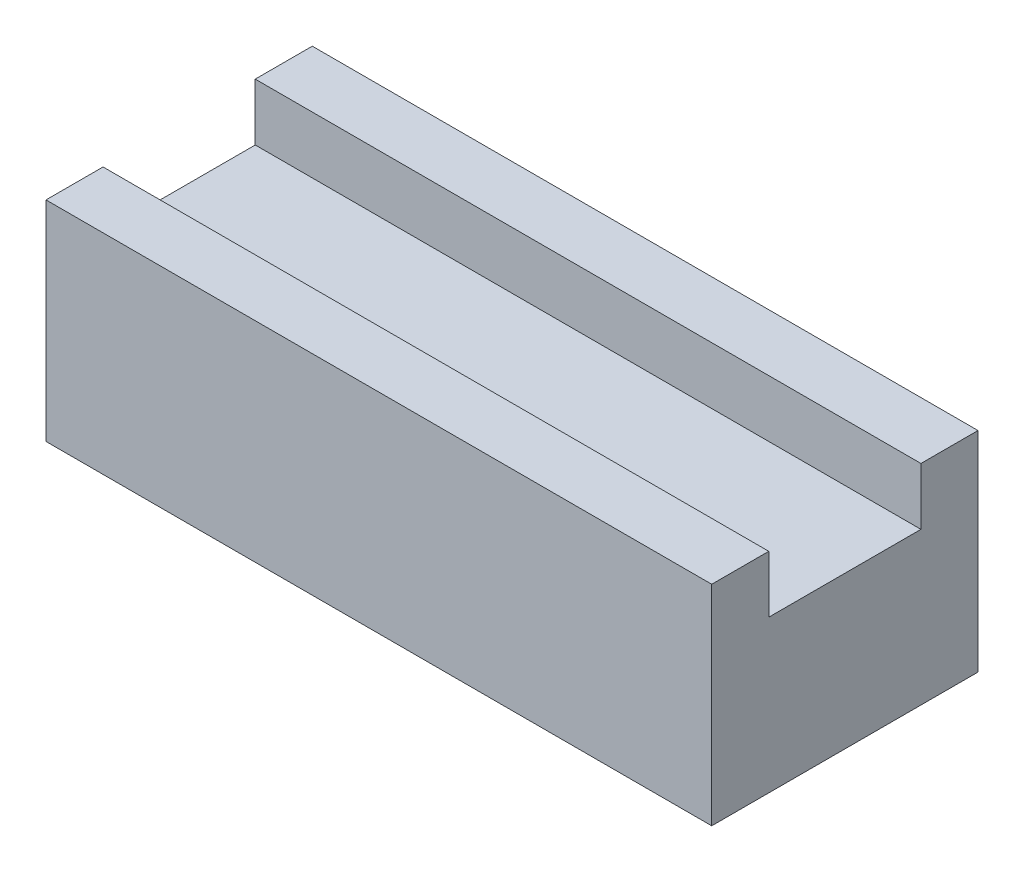
ISO-10303-21;
HEADER;
FILE_DESCRIPTION(('STEP AP214'),'2;1');
FILE_NAME('part.step','',(''),(''),'','','');
FILE_SCHEMA(('AUTOMOTIVE_DESIGN { 1 0 10303 214 1 1 1 1 }'));
ENDSEC;
DATA;
#1=APPLICATION_CONTEXT('core data for automotive mechanical design processes');
#2=APPLICATION_PROTOCOL_DEFINITION('international standard','automotive_design',2000,#1);
#3=PRODUCT_CONTEXT('',#1,'mechanical');
#4=PRODUCT('Part','Part','',(#3));
#5=PRODUCT_RELATED_PRODUCT_CATEGORY('part','',(#4));
#6=PRODUCT_DEFINITION_FORMATION('','',#4);
#7=PRODUCT_DEFINITION_CONTEXT('part definition',#1,'design');
#8=PRODUCT_DEFINITION('design','',#6,#7);
#9=PRODUCT_DEFINITION_SHAPE('','',#8);
#10=(LENGTH_UNIT() NAMED_UNIT(*) SI_UNIT(.MILLI.,.METRE.));
#11=(NAMED_UNIT(*) PLANE_ANGLE_UNIT() SI_UNIT($,.RADIAN.));
#12=(NAMED_UNIT(*) SI_UNIT($,.STERADIAN.) SOLID_ANGLE_UNIT());
#13=UNCERTAINTY_MEASURE_WITH_UNIT(LENGTH_MEASURE(1.E-05),#10,'distance_accuracy_value','');
#14=(GEOMETRIC_REPRESENTATION_CONTEXT(3) GLOBAL_UNCERTAINTY_ASSIGNED_CONTEXT((#13)) GLOBAL_UNIT_ASSIGNED_CONTEXT((#10,
#11,#12)) REPRESENTATION_CONTEXT('',''));
#15=CARTESIAN_POINT('',(0.,0.,0.));
#16=DIRECTION('',(0.,0.,1.));
#17=DIRECTION('',(1.,0.,0.));
#18=AXIS2_PLACEMENT_3D('',#15,#16,#17);
#19=CARTESIAN_POINT('',(-35.,-4.,-7.));
#20=DIRECTION('',(0.,0.,-1.));
#21=DIRECTION('',(0.,1.,0.));
#22=AXIS2_PLACEMENT_3D('',#19,#20,#21);
#23=PLANE('',#22);
#24=DIRECTION('',(0.,1.,0.));
#25=VECTOR('',#24,1.);
#26=CARTESIAN_POINT('',(0.,-4.,-7.));
#27=LINE('',#26,#25);
#28=CARTESIAN_POINT('',(0.,-4.,-7.));
#29=VERTEX_POINT('',#28);
#30=CARTESIAN_POINT('',(0.,7.,-7.));
#31=VERTEX_POINT('',#30);
#32=EDGE_CURVE('E153',#29,#31,#27,.T.);
#33=ORIENTED_EDGE('',*,*,#32,.F.);
#34=DIRECTION('',(1.,0.,0.));
#35=VECTOR('',#34,1.);
#36=CARTESIAN_POINT('',(-35.,-4.,-7.));
#37=LINE('',#36,#35);
#38=CARTESIAN_POINT('',(-35.,-4.,-7.));
#39=VERTEX_POINT('',#38);
#40=EDGE_CURVE('E11',#39,#29,#37,.T.);
#41=ORIENTED_EDGE('',*,*,#40,.F.);
#42=DIRECTION('',(0.,1.,0.));
#43=VECTOR('',#42,1.);
#44=CARTESIAN_POINT('',(-35.,4.,-7.));
#45=LINE('',#44,#43);
#46=CARTESIAN_POINT('',(-35.,7.,-7.));
#47=VERTEX_POINT('',#46);
#48=EDGE_CURVE('E56',#39,#47,#45,.T.);
#49=ORIENTED_EDGE('',*,*,#48,.T.);
#50=DIRECTION('',(1.,0.,0.));
#51=VECTOR('',#50,1.);
#52=CARTESIAN_POINT('',(-35.,7.,-7.));
#53=LINE('',#52,#51);
#54=EDGE_CURVE('E41',#47,#31,#53,.T.);
#55=ORIENTED_EDGE('',*,*,#54,.T.);
#56=EDGE_LOOP('',(#33,#41,#49,#55));
#57=FACE_BOUND('',#56,.T.);
#58=ADVANCED_FACE('F37',(#57),#23,.T.);
#59=CARTESIAN_POINT('',(-35.,-4.,7.));
#60=DIRECTION('',(0.,-1.,0.));
#61=DIRECTION('',(0.,0.,-1.));
#62=AXIS2_PLACEMENT_3D('',#59,#60,#61);
#63=PLANE('',#62);
#64=DIRECTION('',(0.,0.,-1.));
#65=VECTOR('',#64,1.);
#66=CARTESIAN_POINT('',(0.,-4.,7.));
#67=LINE('',#66,#65);
#68=CARTESIAN_POINT('',(0.,-4.,7.));
#69=VERTEX_POINT('',#68);
#70=EDGE_CURVE('E151',#69,#29,#67,.T.);
#71=ORIENTED_EDGE('',*,*,#70,.F.);
#72=DIRECTION('',(1.,0.,0.));
#73=VECTOR('',#72,1.);
#74=CARTESIAN_POINT('',(-35.,-4.,7.));
#75=LINE('',#74,#73);
#76=CARTESIAN_POINT('',(-35.,-4.,7.));
#77=VERTEX_POINT('',#76);
#78=EDGE_CURVE('E47',#77,#69,#75,.T.);
#79=ORIENTED_EDGE('',*,*,#78,.F.);
#80=DIRECTION('',(0.,0.,-1.));
#81=VECTOR('',#80,1.);
#82=CARTESIAN_POINT('',(-35.,-4.,7.));
#83=LINE('',#82,#81);
#84=EDGE_CURVE('E126',#77,#39,#83,.T.);
#85=ORIENTED_EDGE('',*,*,#84,.T.);
#86=ORIENTED_EDGE('',*,*,#40,.T.);
#87=EDGE_LOOP('',(#71,#79,#85,#86));
#88=FACE_BOUND('',#87,.T.);
#89=ADVANCED_FACE('F166',(#88),#63,.T.);
#90=CARTESIAN_POINT('',(-35.,-4.,7.));
#91=DIRECTION('',(0.,0.,1.));
#92=DIRECTION('',(0.,-1.,0.));
#93=AXIS2_PLACEMENT_3D('',#90,#91,#92);
#94=PLANE('',#93);
#95=DIRECTION('',(0.,-1.,0.));
#96=VECTOR('',#95,1.);
#97=CARTESIAN_POINT('',(0.,-4.,7.));
#98=LINE('',#97,#96);
#99=CARTESIAN_POINT('',(0.,7.,7.));
#100=VERTEX_POINT('',#99);
#101=EDGE_CURVE('E114',#100,#69,#98,.T.);
#102=ORIENTED_EDGE('',*,*,#101,.F.);
#103=DIRECTION('',(1.,0.,0.));
#104=VECTOR('',#103,1.);
#105=CARTESIAN_POINT('',(-35.,7.,7.));
#106=LINE('',#105,#104);
#107=CARTESIAN_POINT('',(-35.,7.,7.));
#108=VERTEX_POINT('',#107);
#109=EDGE_CURVE('E109',#108,#100,#106,.T.);
#110=ORIENTED_EDGE('',*,*,#109,.F.);
#111=DIRECTION('',(0.,-1.,0.));
#112=VECTOR('',#111,1.);
#113=CARTESIAN_POINT('',(-35.,4.,7.));
#114=LINE('',#113,#112);
#115=EDGE_CURVE('E112',#108,#77,#114,.T.);
#116=ORIENTED_EDGE('',*,*,#115,.T.);
#117=ORIENTED_EDGE('',*,*,#78,.T.);
#118=EDGE_LOOP('',(#102,#110,#116,#117));
#119=FACE_BOUND('',#118,.T.);
#120=ADVANCED_FACE('F111',(#119),#94,.T.);
#121=CARTESIAN_POINT('',(-35.,7.,7.));
#122=DIRECTION('',(0.,1.,0.));
#123=DIRECTION('',(0.,0.,1.));
#124=AXIS2_PLACEMENT_3D('',#121,#122,#123);
#125=PLANE('',#124);
#126=DIRECTION('',(0.,0.,1.));
#127=VECTOR('',#126,1.);
#128=CARTESIAN_POINT('',(0.,7.,7.));
#129=LINE('',#128,#127);
#130=CARTESIAN_POINT('',(0.,7.,4.));
#131=VERTEX_POINT('',#130);
#132=EDGE_CURVE('E148',#131,#100,#129,.T.);
#133=ORIENTED_EDGE('',*,*,#132,.F.);
#134=DIRECTION('',(1.,0.,0.));
#135=VECTOR('',#134,1.);
#136=CARTESIAN_POINT('',(-35.,7.,4.));
#137=LINE('',#136,#135);
#138=CARTESIAN_POINT('',(-35.,7.,4.));
#139=VERTEX_POINT('',#138);
#140=EDGE_CURVE('E119',#139,#131,#137,.T.);
#141=ORIENTED_EDGE('',*,*,#140,.F.);
#142=DIRECTION('',(0.,0.,1.));
#143=VECTOR('',#142,1.);
#144=CARTESIAN_POINT('',(-35.,7.,7.));
#145=LINE('',#144,#143);
#146=EDGE_CURVE('E124',#139,#108,#145,.T.);
#147=ORIENTED_EDGE('',*,*,#146,.T.);
#148=ORIENTED_EDGE('',*,*,#109,.T.);
#149=EDGE_LOOP('',(#133,#141,#147,#148));
#150=FACE_BOUND('',#149,.T.);
#151=ADVANCED_FACE('F128',(#150),#125,.T.);
#152=CARTESIAN_POINT('',(-35.,7.,4.));
#153=DIRECTION('',(0.,0.,-1.));
#154=DIRECTION('',(0.,1.,0.));
#155=AXIS2_PLACEMENT_3D('',#152,#153,#154);
#156=PLANE('',#155);
#157=DIRECTION('',(0.,1.,0.));
#158=VECTOR('',#157,1.);
#159=CARTESIAN_POINT('',(0.,7.,4.));
#160=LINE('',#159,#158);
#161=CARTESIAN_POINT('',(0.,4.,4.));
#162=VERTEX_POINT('',#161);
#163=EDGE_CURVE('E145',#162,#131,#160,.T.);
#164=ORIENTED_EDGE('',*,*,#163,.F.);
#165=DIRECTION('',(1.,0.,0.));
#166=VECTOR('',#165,1.);
#167=CARTESIAN_POINT('',(-35.,4.,4.));
#168=LINE('',#167,#166);
#169=CARTESIAN_POINT('',(-35.,4.,4.));
#170=VERTEX_POINT('',#169);
#171=EDGE_CURVE('E157',#170,#162,#168,.T.);
#172=ORIENTED_EDGE('',*,*,#171,.F.);
#173=DIRECTION('',(0.,1.,0.));
#174=VECTOR('',#173,1.);
#175=CARTESIAN_POINT('',(-35.,7.,4.));
#176=LINE('',#175,#174);
#177=EDGE_CURVE('E129',#170,#139,#176,.T.);
#178=ORIENTED_EDGE('',*,*,#177,.T.);
#179=ORIENTED_EDGE('',*,*,#140,.T.);
#180=EDGE_LOOP('',(#164,#172,#178,#179));
#181=FACE_BOUND('',#180,.T.);
#182=ADVANCED_FACE('F179',(#181),#156,.T.);
#183=CARTESIAN_POINT('',(-35.,4.,4.));
#184=DIRECTION('',(0.,1.,0.));
#185=DIRECTION('',(0.,0.,1.));
#186=AXIS2_PLACEMENT_3D('',#183,#184,#185);
#187=PLANE('',#186);
#188=DIRECTION('',(0.,0.,1.));
#189=VECTOR('',#188,1.);
#190=CARTESIAN_POINT('',(0.,4.,4.));
#191=LINE('',#190,#189);
#192=CARTESIAN_POINT('',(0.,4.,-4.));
#193=VERTEX_POINT('',#192);
#194=EDGE_CURVE('E142',#193,#162,#191,.T.);
#195=ORIENTED_EDGE('',*,*,#194,.F.);
#196=DIRECTION('',(1.,0.,0.));
#197=VECTOR('',#196,1.);
#198=CARTESIAN_POINT('',(-35.,4.,-4.));
#199=LINE('',#198,#197);
#200=CARTESIAN_POINT('',(-35.,4.,-4.));
#201=VERTEX_POINT('',#200);
#202=EDGE_CURVE('E159',#201,#193,#199,.T.);
#203=ORIENTED_EDGE('',*,*,#202,.F.);
#204=DIRECTION('',(0.,0.,1.));
#205=VECTOR('',#204,1.);
#206=CARTESIAN_POINT('',(-35.,4.,4.));
#207=LINE('',#206,#205);
#208=EDGE_CURVE('E131',#201,#170,#207,.T.);
#209=ORIENTED_EDGE('',*,*,#208,.T.);
#210=ORIENTED_EDGE('',*,*,#171,.T.);
#211=EDGE_LOOP('',(#195,#203,#209,#210));
#212=FACE_BOUND('',#211,.T.);
#213=ADVANCED_FACE('F182',(#212),#187,.T.);
#214=CARTESIAN_POINT('',(-35.,7.,-4.));
#215=DIRECTION('',(0.,0.,1.));
#216=DIRECTION('',(0.,-1.,0.));
#217=AXIS2_PLACEMENT_3D('',#214,#215,#216);
#218=PLANE('',#217);
#219=DIRECTION('',(0.,-1.,0.));
#220=VECTOR('',#219,1.);
#221=CARTESIAN_POINT('',(0.,7.,-4.));
#222=LINE('',#221,#220);
#223=CARTESIAN_POINT('',(0.,7.,-4.));
#224=VERTEX_POINT('',#223);
#225=EDGE_CURVE('E139',#224,#193,#222,.T.);
#226=ORIENTED_EDGE('',*,*,#225,.F.);
#227=DIRECTION('',(1.,0.,0.));
#228=VECTOR('',#227,1.);
#229=CARTESIAN_POINT('',(-35.,7.,-4.));
#230=LINE('',#229,#228);
#231=CARTESIAN_POINT('',(-35.,7.,-4.));
#232=VERTEX_POINT('',#231);
#233=EDGE_CURVE('E160',#232,#224,#230,.T.);
#234=ORIENTED_EDGE('',*,*,#233,.F.);
#235=DIRECTION('',(0.,-1.,0.));
#236=VECTOR('',#235,1.);
#237=CARTESIAN_POINT('',(-35.,7.,-4.));
#238=LINE('',#237,#236);
#239=EDGE_CURVE('E195',#232,#201,#238,.T.);
#240=ORIENTED_EDGE('',*,*,#239,.T.);
#241=ORIENTED_EDGE('',*,*,#202,.T.);
#242=EDGE_LOOP('',(#226,#234,#240,#241));
#243=FACE_BOUND('',#242,.T.);
#244=ADVANCED_FACE('F185',(#243),#218,.T.);
#245=CARTESIAN_POINT('',(-35.,7.,-7.));
#246=DIRECTION('',(0.,1.,0.));
#247=DIRECTION('',(0.,0.,1.));
#248=AXIS2_PLACEMENT_3D('',#245,#246,#247);
#249=PLANE('',#248);
#250=DIRECTION('',(0.,0.,1.));
#251=VECTOR('',#250,1.);
#252=CARTESIAN_POINT('',(0.,7.,-7.));
#253=LINE('',#252,#251);
#254=EDGE_CURVE('E136',#31,#224,#253,.T.);
#255=ORIENTED_EDGE('',*,*,#254,.F.);
#256=ORIENTED_EDGE('',*,*,#54,.F.);
#257=DIRECTION('',(0.,0.,1.));
#258=VECTOR('',#257,1.);
#259=CARTESIAN_POINT('',(-35.,7.,-7.));
#260=LINE('',#259,#258);
#261=EDGE_CURVE('E199',#47,#232,#260,.T.);
#262=ORIENTED_EDGE('',*,*,#261,.T.);
#263=ORIENTED_EDGE('',*,*,#233,.T.);
#264=EDGE_LOOP('',(#255,#256,#262,#263));
#265=FACE_BOUND('',#264,.T.);
#266=ADVANCED_FACE('F39',(#265),#249,.T.);
#267=CARTESIAN_POINT('',(-35.,0.,0.));
#268=DIRECTION('',(1.,0.,0.));
#269=DIRECTION('',(0.,0.,-1.));
#270=AXIS2_PLACEMENT_3D('',#267,#268,#269);
#271=PLANE('',#270);
#272=ORIENTED_EDGE('',*,*,#48,.F.);
#273=ORIENTED_EDGE('',*,*,#84,.F.);
#274=ORIENTED_EDGE('',*,*,#115,.F.);
#275=ORIENTED_EDGE('',*,*,#146,.F.);
#276=ORIENTED_EDGE('',*,*,#177,.F.);
#277=ORIENTED_EDGE('',*,*,#208,.F.);
#278=ORIENTED_EDGE('',*,*,#239,.F.);
#279=ORIENTED_EDGE('',*,*,#261,.F.);
#280=EDGE_LOOP('',(#272,#273,#274,#275,#276,#277,#278,#279));
#281=FACE_BOUND('',#280,.T.);
#282=ADVANCED_FACE('F122',(#281),#271,.F.);
#283=CARTESIAN_POINT('',(0.,0.,0.));
#284=DIRECTION('',(1.,0.,0.));
#285=DIRECTION('',(0.,0.,-1.));
#286=AXIS2_PLACEMENT_3D('',#283,#284,#285);
#287=PLANE('',#286);
#288=ORIENTED_EDGE('',*,*,#32,.T.);
#289=ORIENTED_EDGE('',*,*,#254,.T.);
#290=ORIENTED_EDGE('',*,*,#225,.T.);
#291=ORIENTED_EDGE('',*,*,#194,.T.);
#292=ORIENTED_EDGE('',*,*,#163,.T.);
#293=ORIENTED_EDGE('',*,*,#132,.T.);
#294=ORIENTED_EDGE('',*,*,#101,.T.);
#295=ORIENTED_EDGE('',*,*,#70,.T.);
#296=EDGE_LOOP('',(#288,#289,#290,#291,#292,#293,#294,#295));
#297=FACE_BOUND('',#296,.T.);
#298=ADVANCED_FACE('F165',(#297),#287,.T.);
#299=CLOSED_SHELL('',(#58,#89,#120,#151,#182,#213,#244,#266,#282,#298));
#300=MANIFOLD_SOLID_BREP('B2',#299);
#301=ADVANCED_BREP_SHAPE_REPRESENTATION('',(#18,#300),#14);
#302=SHAPE_DEFINITION_REPRESENTATION(#9,#301);
ENDSEC;
END-ISO-10303-21;
